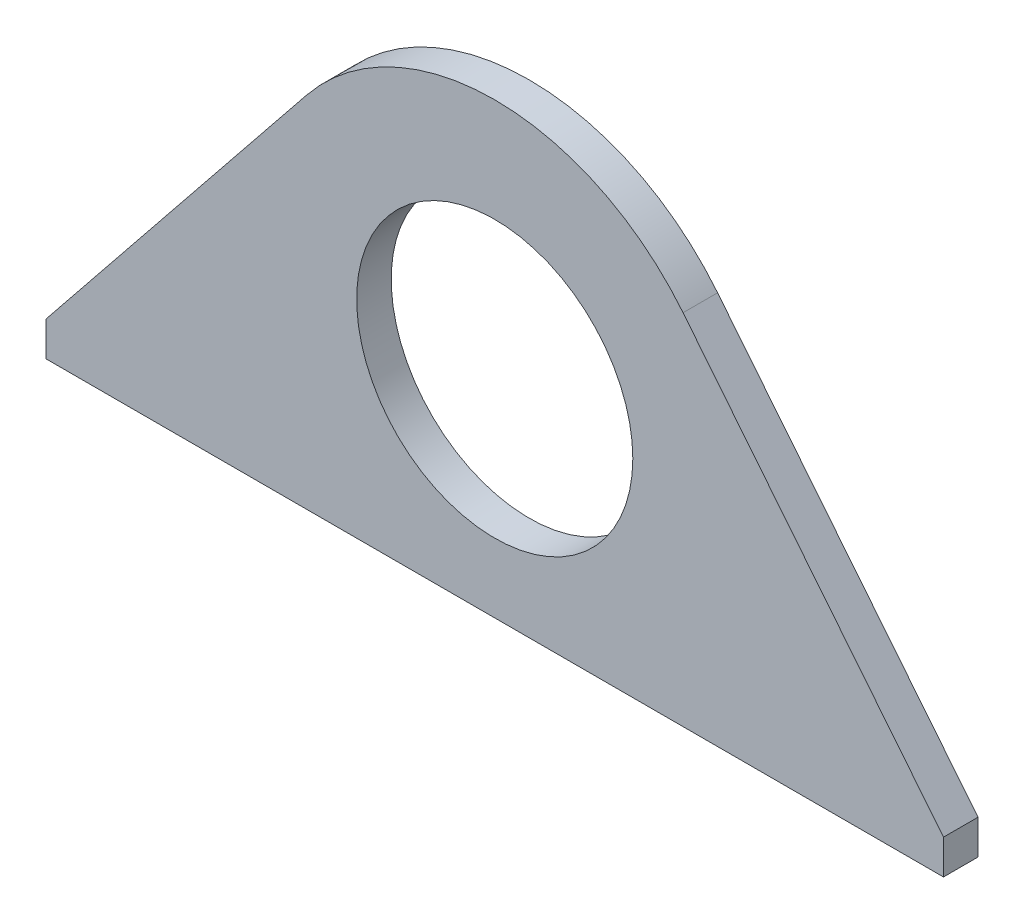
ISO-10303-21;
HEADER;
FILE_DESCRIPTION(('STEP AP214'),'2;1');
FILE_NAME('part.step','',(''),(''),'','','');
FILE_SCHEMA(('AUTOMOTIVE_DESIGN { 1 0 10303 214 1 1 1 1 }'));
ENDSEC;
DATA;
#1=APPLICATION_CONTEXT('core data for automotive mechanical design processes');
#2=APPLICATION_PROTOCOL_DEFINITION('international standard','automotive_design',2000,#1);
#3=PRODUCT_CONTEXT('',#1,'mechanical');
#4=PRODUCT('Part','Part','',(#3));
#5=PRODUCT_RELATED_PRODUCT_CATEGORY('part','',(#4));
#6=PRODUCT_DEFINITION_FORMATION('','',#4);
#7=PRODUCT_DEFINITION_CONTEXT('part definition',#1,'design');
#8=PRODUCT_DEFINITION('design','',#6,#7);
#9=PRODUCT_DEFINITION_SHAPE('','',#8);
#10=(LENGTH_UNIT() NAMED_UNIT(*) SI_UNIT(.MILLI.,.METRE.));
#11=(NAMED_UNIT(*) PLANE_ANGLE_UNIT() SI_UNIT($,.RADIAN.));
#12=(NAMED_UNIT(*) SI_UNIT($,.STERADIAN.) SOLID_ANGLE_UNIT());
#13=UNCERTAINTY_MEASURE_WITH_UNIT(LENGTH_MEASURE(1.E-05),#10,'distance_accuracy_value','');
#14=(GEOMETRIC_REPRESENTATION_CONTEXT(3) GLOBAL_UNCERTAINTY_ASSIGNED_CONTEXT((#13)) GLOBAL_UNIT_ASSIGNED_CONTEXT((#10,
#11,#12)) REPRESENTATION_CONTEXT('',''));
#15=CARTESIAN_POINT('',(0.,0.,0.));
#16=DIRECTION('',(0.,0.,1.));
#17=DIRECTION('',(1.,0.,0.));
#18=AXIS2_PLACEMENT_3D('',#15,#16,#17);
#19=CARTESIAN_POINT('',(-65.,0.,-2.5));
#20=DIRECTION('',(-1.,0.,0.));
#21=DIRECTION('',(0.,0.,1.));
#22=AXIS2_PLACEMENT_3D('',#19,#20,#21);
#23=PLANE('',#22);
#24=DIRECTION('',(0.,0.,1.));
#25=VECTOR('',#24,1.);
#26=CARTESIAN_POINT('',(-65.,0.,-2.5));
#27=LINE('',#26,#25);
#28=CARTESIAN_POINT('',(-65.,0.,-2.5));
#29=VERTEX_POINT('',#28);
#30=CARTESIAN_POINT('',(-65.,0.,2.5));
#31=VERTEX_POINT('',#30);
#32=EDGE_CURVE('E42',#29,#31,#27,.T.);
#33=ORIENTED_EDGE('',*,*,#32,.T.);
#34=DIRECTION('',(0.,-1.,0.));
#35=VECTOR('',#34,1.);
#36=CARTESIAN_POINT('',(-65.,0.,2.5));
#37=LINE('',#36,#35);
#38=CARTESIAN_POINT('',(-65.,5.,2.5));
#39=VERTEX_POINT('',#38);
#40=EDGE_CURVE('E95',#39,#31,#37,.T.);
#41=ORIENTED_EDGE('',*,*,#40,.F.);
#42=DIRECTION('',(0.,0.,1.));
#43=VECTOR('',#42,1.);
#44=CARTESIAN_POINT('',(-65.,5.,-2.5));
#45=LINE('',#44,#43);
#46=CARTESIAN_POINT('',(-65.,5.,-2.5));
#47=VERTEX_POINT('',#46);
#48=EDGE_CURVE('E11',#47,#39,#45,.T.);
#49=ORIENTED_EDGE('',*,*,#48,.F.);
#50=DIRECTION('',(0.,-1.,0.));
#51=VECTOR('',#50,1.);
#52=CARTESIAN_POINT('',(-65.,0.,-2.5));
#53=LINE('',#52,#51);
#54=EDGE_CURVE('E91',#47,#29,#53,.T.);
#55=ORIENTED_EDGE('',*,*,#54,.T.);
#56=EDGE_LOOP('',(#33,#41,#49,#55));
#57=FACE_BOUND('',#56,.T.);
#58=ADVANCED_FACE('F41',(#57),#23,.T.);
#59=CARTESIAN_POINT('',(-65.,5.,-2.5));
#60=DIRECTION('',(-0.779422540690523,0.62649860579536,0.));
#61=DIRECTION('',(-0.62649860579536,-0.779422540690523,0.));
#62=AXIS2_PLACEMENT_3D('',#59,#60,#61);
#63=PLANE('',#62);
#64=ORIENTED_EDGE('',*,*,#48,.T.);
#65=DIRECTION('',(-0.62649860579536,-0.779422540690523,0.));
#66=VECTOR('',#65,1.);
#67=CARTESIAN_POINT('',(-65.,5.,2.5));
#68=LINE('',#67,#66);
#69=CARTESIAN_POINT('',(-27.2797889241683,51.9274512028376,2.5));
#70=VERTEX_POINT('',#69);
#71=EDGE_CURVE('E115',#70,#39,#68,.T.);
#72=ORIENTED_EDGE('',*,*,#71,.F.);
#73=DIRECTION('',(0.,0.,1.));
#74=VECTOR('',#73,1.);
#75=CARTESIAN_POINT('',(-27.2797889241683,51.9274512028376,-2.5));
#76=LINE('',#75,#74);
#77=CARTESIAN_POINT('',(-27.2797889241683,51.9274512028376,-2.5));
#78=VERTEX_POINT('',#77);
#79=EDGE_CURVE('E47',#78,#70,#76,.T.);
#80=ORIENTED_EDGE('',*,*,#79,.F.);
#81=DIRECTION('',(-0.62649860579536,-0.779422540690523,0.));
#82=VECTOR('',#81,1.);
#83=CARTESIAN_POINT('',(-65.,5.,-2.5));
#84=LINE('',#83,#82);
#85=EDGE_CURVE('E100',#78,#47,#84,.T.);
#86=ORIENTED_EDGE('',*,*,#85,.T.);
#87=EDGE_LOOP('',(#64,#72,#80,#86));
#88=FACE_BOUND('',#87,.T.);
#89=ADVANCED_FACE('F160',(#88),#63,.T.);
#90=CARTESIAN_POINT('',(0.,30.,-2.5));
#91=DIRECTION('',(0.,0.,1.));
#92=DIRECTION('',(1.,0.,0.));
#93=AXIS2_PLACEMENT_3D('',#90,#91,#92);
#94=CYLINDRICAL_SURFACE('',#93,35.);
#95=ORIENTED_EDGE('',*,*,#79,.T.);
#96=CARTESIAN_POINT('',(0.,30.,2.5));
#97=DIRECTION('',(0.,0.,1.));
#98=DIRECTION('',(-1.,0.,0.));
#99=AXIS2_PLACEMENT_3D('',#96,#97,#98);
#100=CIRCLE('',#99,35.);
#101=CARTESIAN_POINT('',(27.2797889241683,51.9274512028376,2.5));
#102=VERTEX_POINT('',#101);
#103=EDGE_CURVE('E125',#102,#70,#100,.T.);
#104=ORIENTED_EDGE('',*,*,#103,.F.);
#105=DIRECTION('',(0.,0.,1.));
#106=VECTOR('',#105,1.);
#107=CARTESIAN_POINT('',(27.2797889241683,51.9274512028376,-2.5));
#108=LINE('',#107,#106);
#109=CARTESIAN_POINT('',(27.2797889241683,51.9274512028376,-2.5));
#110=VERTEX_POINT('',#109);
#111=EDGE_CURVE('E142',#110,#102,#108,.T.);
#112=ORIENTED_EDGE('',*,*,#111,.F.);
#113=CARTESIAN_POINT('',(0.,30.,-2.5));
#114=DIRECTION('',(0.,0.,1.));
#115=DIRECTION('',(-1.,0.,0.));
#116=AXIS2_PLACEMENT_3D('',#113,#114,#115);
#117=CIRCLE('',#116,35.);
#118=EDGE_CURVE('E139',#110,#78,#117,.T.);
#119=ORIENTED_EDGE('',*,*,#118,.T.);
#120=EDGE_LOOP('',(#95,#104,#112,#119));
#121=FACE_BOUND('',#120,.T.);
#122=ADVANCED_FACE('F151',(#121),#94,.T.);
#123=CARTESIAN_POINT('',(27.2797889241683,51.9274512028376,-2.5));
#124=DIRECTION('',(0.779422540690523,0.62649860579536,0.));
#125=DIRECTION('',(-0.62649860579536,0.779422540690523,0.));
#126=AXIS2_PLACEMENT_3D('',#123,#124,#125);
#127=PLANE('',#126);
#128=ORIENTED_EDGE('',*,*,#111,.T.);
#129=DIRECTION('',(-0.62649860579536,0.779422540690523,0.));
#130=VECTOR('',#129,1.);
#131=CARTESIAN_POINT('',(27.2797889241683,51.9274512028376,2.5));
#132=LINE('',#131,#130);
#133=CARTESIAN_POINT('',(65.,5.00000000000002,2.5));
#134=VERTEX_POINT('',#133);
#135=EDGE_CURVE('E118',#134,#102,#132,.T.);
#136=ORIENTED_EDGE('',*,*,#135,.F.);
#137=DIRECTION('',(0.,0.,1.));
#138=VECTOR('',#137,1.);
#139=CARTESIAN_POINT('',(65.,5.00000000000002,-2.5));
#140=LINE('',#139,#138);
#141=CARTESIAN_POINT('',(65.,5.00000000000002,-2.5));
#142=VERTEX_POINT('',#141);
#143=EDGE_CURVE('E141',#142,#134,#140,.T.);
#144=ORIENTED_EDGE('',*,*,#143,.F.);
#145=DIRECTION('',(-0.62649860579536,0.779422540690523,0.));
#146=VECTOR('',#145,1.);
#147=CARTESIAN_POINT('',(27.2797889241683,51.9274512028376,-2.5));
#148=LINE('',#147,#146);
#149=EDGE_CURVE('E131',#142,#110,#148,.T.);
#150=ORIENTED_EDGE('',*,*,#149,.T.);
#151=EDGE_LOOP('',(#128,#136,#144,#150));
#152=FACE_BOUND('',#151,.T.);
#153=ADVANCED_FACE('F152',(#152),#127,.T.);
#154=CARTESIAN_POINT('',(65.,0.,-2.5));
#155=DIRECTION('',(1.,0.,0.));
#156=DIRECTION('',(0.,0.,-1.));
#157=AXIS2_PLACEMENT_3D('',#154,#155,#156);
#158=PLANE('',#157);
#159=ORIENTED_EDGE('',*,*,#143,.T.);
#160=DIRECTION('',(0.,1.,0.));
#161=VECTOR('',#160,1.);
#162=CARTESIAN_POINT('',(65.,0.,2.5));
#163=LINE('',#162,#161);
#164=CARTESIAN_POINT('',(65.,0.,2.5));
#165=VERTEX_POINT('',#164);
#166=EDGE_CURVE('E106',#165,#134,#163,.T.);
#167=ORIENTED_EDGE('',*,*,#166,.F.);
#168=DIRECTION('',(0.,0.,1.));
#169=VECTOR('',#168,1.);
#170=CARTESIAN_POINT('',(65.,0.,-2.5));
#171=LINE('',#170,#169);
#172=CARTESIAN_POINT('',(65.,0.,-2.5));
#173=VERTEX_POINT('',#172);
#174=EDGE_CURVE('E96',#173,#165,#171,.T.);
#175=ORIENTED_EDGE('',*,*,#174,.F.);
#176=DIRECTION('',(0.,1.,0.));
#177=VECTOR('',#176,1.);
#178=CARTESIAN_POINT('',(65.,0.,-2.5));
#179=LINE('',#178,#177);
#180=EDGE_CURVE('E132',#173,#142,#179,.T.);
#181=ORIENTED_EDGE('',*,*,#180,.T.);
#182=EDGE_LOOP('',(#159,#167,#175,#181));
#183=FACE_BOUND('',#182,.T.);
#184=ADVANCED_FACE('F143',(#183),#158,.T.);
#185=CARTESIAN_POINT('',(-65.,0.,-2.5));
#186=DIRECTION('',(0.,-1.,0.));
#187=DIRECTION('',(1.,0.,0.));
#188=AXIS2_PLACEMENT_3D('',#185,#186,#187);
#189=PLANE('',#188);
#190=ORIENTED_EDGE('',*,*,#174,.T.);
#191=DIRECTION('',(1.,0.,0.));
#192=VECTOR('',#191,1.);
#193=CARTESIAN_POINT('',(-65.,0.,2.5));
#194=LINE('',#193,#192);
#195=EDGE_CURVE('E103',#31,#165,#194,.T.);
#196=ORIENTED_EDGE('',*,*,#195,.F.);
#197=ORIENTED_EDGE('',*,*,#32,.F.);
#198=DIRECTION('',(1.,0.,0.));
#199=VECTOR('',#198,1.);
#200=CARTESIAN_POINT('',(-65.,0.,-2.5));
#201=LINE('',#200,#199);
#202=EDGE_CURVE('E128',#29,#173,#201,.T.);
#203=ORIENTED_EDGE('',*,*,#202,.T.);
#204=EDGE_LOOP('',(#190,#196,#197,#203));
#205=FACE_BOUND('',#204,.T.);
#206=ADVANCED_FACE('F105',(#205),#189,.T.);
#207=CARTESIAN_POINT('',(0.,30.,-2.5));
#208=DIRECTION('',(0.,0.,-1.));
#209=DIRECTION('',(-1.,0.,0.));
#210=AXIS2_PLACEMENT_3D('',#207,#208,#209);
#211=PLANE('',#210);
#212=CARTESIAN_POINT('',(0.,30.,-2.5));
#213=DIRECTION('',(0.,0.,1.));
#214=DIRECTION('',(1.,0.,0.));
#215=AXIS2_PLACEMENT_3D('',#212,#213,#214);
#216=CIRCLE('',#215,20.);
#217=CARTESIAN_POINT('',(20.,30.,-2.5));
#218=VERTEX_POINT('',#217);
#219=EDGE_CURVE('E123',#218,#218,#216,.T.);
#220=ORIENTED_EDGE('',*,*,#219,.T.);
#221=EDGE_LOOP('',(#220));
#222=FACE_BOUND('',#221,.T.);
#223=ORIENTED_EDGE('',*,*,#54,.F.);
#224=ORIENTED_EDGE('',*,*,#85,.F.);
#225=ORIENTED_EDGE('',*,*,#118,.F.);
#226=ORIENTED_EDGE('',*,*,#149,.F.);
#227=ORIENTED_EDGE('',*,*,#180,.F.);
#228=ORIENTED_EDGE('',*,*,#202,.F.);
#229=EDGE_LOOP('',(#223,#224,#225,#226,#227,#228));
#230=FACE_BOUND('',#229,.T.);
#231=ADVANCED_FACE('F159',(#222,#230),#211,.T.);
#232=CARTESIAN_POINT('',(0.,30.,-2.5));
#233=DIRECTION('',(0.,0.,1.));
#234=DIRECTION('',(1.,0.,0.));
#235=AXIS2_PLACEMENT_3D('',#232,#233,#234);
#236=CYLINDRICAL_SURFACE('',#235,20.);
#237=ORIENTED_EDGE('',*,*,#219,.F.);
#238=EDGE_LOOP('',(#237));
#239=FACE_BOUND('',#238,.T.);
#240=CARTESIAN_POINT('',(0.,30.,2.5));
#241=DIRECTION('',(0.,0.,1.));
#242=DIRECTION('',(1.,0.,0.));
#243=AXIS2_PLACEMENT_3D('',#240,#241,#242);
#244=CIRCLE('',#243,20.);
#245=CARTESIAN_POINT('',(20.,30.,2.5));
#246=VERTEX_POINT('',#245);
#247=EDGE_CURVE('E113',#246,#246,#244,.T.);
#248=ORIENTED_EDGE('',*,*,#247,.T.);
#249=EDGE_LOOP('',(#248));
#250=FACE_BOUND('',#249,.T.);
#251=ADVANCED_FACE('F176',(#239,#250),#236,.F.);
#252=CARTESIAN_POINT('',(0.,30.,2.5));
#253=DIRECTION('',(0.,0.,-1.));
#254=DIRECTION('',(-1.,0.,0.));
#255=AXIS2_PLACEMENT_3D('',#252,#253,#254);
#256=PLANE('',#255);
#257=ORIENTED_EDGE('',*,*,#40,.T.);
#258=ORIENTED_EDGE('',*,*,#195,.T.);
#259=ORIENTED_EDGE('',*,*,#166,.T.);
#260=ORIENTED_EDGE('',*,*,#135,.T.);
#261=ORIENTED_EDGE('',*,*,#103,.T.);
#262=ORIENTED_EDGE('',*,*,#71,.T.);
#263=EDGE_LOOP('',(#257,#258,#259,#260,#261,#262));
#264=FACE_BOUND('',#263,.T.);
#265=ORIENTED_EDGE('',*,*,#247,.F.);
#266=EDGE_LOOP('',(#265));
#267=FACE_BOUND('',#266,.T.);
#268=ADVANCED_FACE('F107',(#264,#267),#256,.F.);
#269=CLOSED_SHELL('',(#58,#89,#122,#153,#184,#206,#231,#251,#268));
#270=MANIFOLD_SOLID_BREP('B2',#269);
#271=ADVANCED_BREP_SHAPE_REPRESENTATION('',(#18,#270),#14);
#272=SHAPE_DEFINITION_REPRESENTATION(#9,#271);
ENDSEC;
END-ISO-10303-21;
